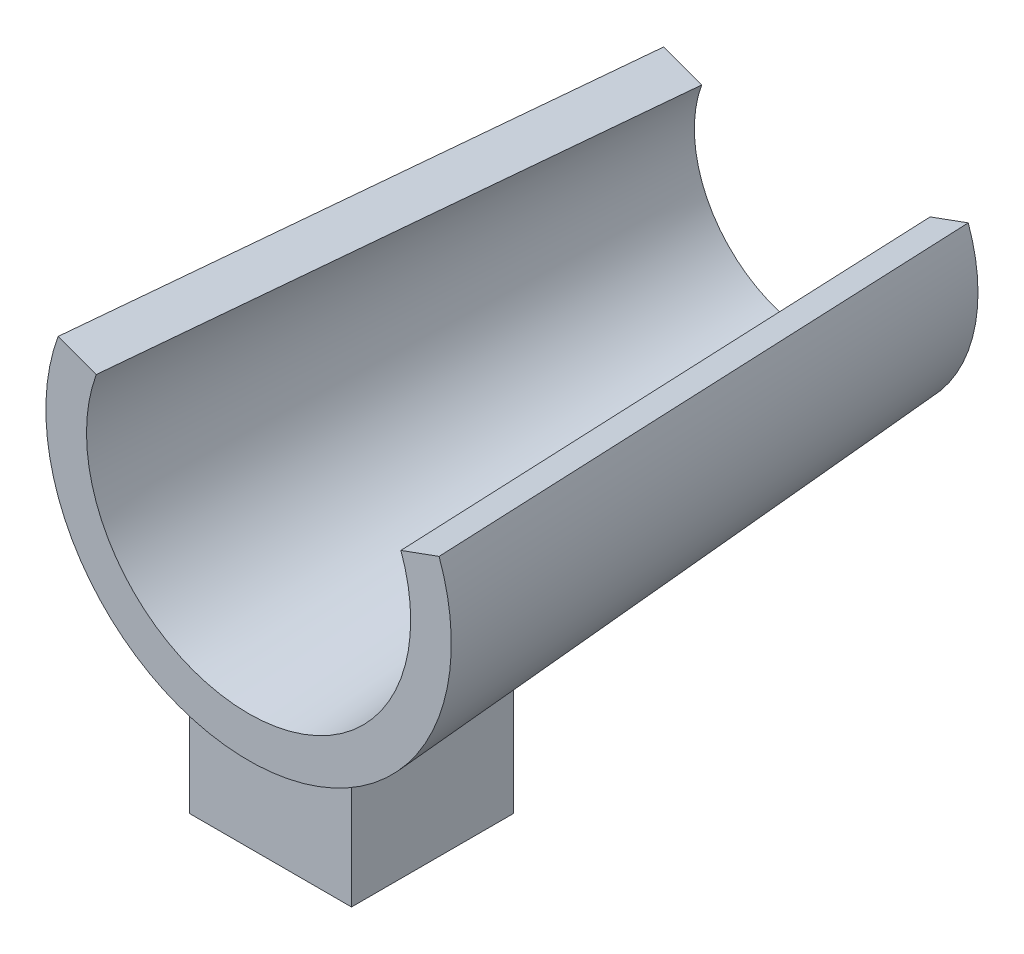
ISO-10303-21;
HEADER;
FILE_DESCRIPTION(('STEP AP214'),'2;1');
FILE_NAME('part.step','',(''),(''),'','','');
FILE_SCHEMA(('AUTOMOTIVE_DESIGN { 1 0 10303 214 1 1 1 1 }'));
ENDSEC;
DATA;
#1=APPLICATION_CONTEXT('core data for automotive mechanical design processes');
#2=APPLICATION_PROTOCOL_DEFINITION('international standard','automotive_design',2000,#1);
#3=PRODUCT_CONTEXT('',#1,'mechanical');
#4=PRODUCT('Part','Part','',(#3));
#5=PRODUCT_RELATED_PRODUCT_CATEGORY('part','',(#4));
#6=PRODUCT_DEFINITION_FORMATION('','',#4);
#7=PRODUCT_DEFINITION_CONTEXT('part definition',#1,'design');
#8=PRODUCT_DEFINITION('design','',#6,#7);
#9=PRODUCT_DEFINITION_SHAPE('','',#8);
#10=(LENGTH_UNIT() NAMED_UNIT(*) SI_UNIT(.MILLI.,.METRE.));
#11=(NAMED_UNIT(*) PLANE_ANGLE_UNIT() SI_UNIT($,.RADIAN.));
#12=(NAMED_UNIT(*) SI_UNIT($,.STERADIAN.) SOLID_ANGLE_UNIT());
#13=UNCERTAINTY_MEASURE_WITH_UNIT(LENGTH_MEASURE(1.E-05),#10,'distance_accuracy_value','');
#14=(GEOMETRIC_REPRESENTATION_CONTEXT(3) GLOBAL_UNCERTAINTY_ASSIGNED_CONTEXT((#13)) GLOBAL_UNIT_ASSIGNED_CONTEXT((#10,
#11,#12)) REPRESENTATION_CONTEXT('',''));
#15=CARTESIAN_POINT('',(0.,0.,0.));
#16=DIRECTION('',(0.,0.,1.));
#17=DIRECTION('',(1.,0.,0.));
#18=AXIS2_PLACEMENT_3D('',#15,#16,#17);
#19=CARTESIAN_POINT('',(0.,0.,-88.9));
#20=DIRECTION('',(0.,0.,1.));
#21=DIRECTION('',(1.,0.,0.));
#22=AXIS2_PLACEMENT_3D('',#19,#20,#21);
#23=CONICAL_SURFACE('',#22,50.8,0.0714885225819093);
#24=CARTESIAN_POINT('',(0.,0.,82.0460584084267));
#25=DIRECTION('',(0.,0.,-1.));
#26=DIRECTION('',(-1.,0.,0.));
#27=AXIS2_PLACEMENT_3D('',#24,#25,#26);
#28=CIRCLE('',#27,63.0415421766647);
#29=CARTESIAN_POINT('',(-25.4,-57.698145897526,82.0460584084267));
#30=VERTEX_POINT('',#29);
#31=CARTESIAN_POINT('',(25.4,-57.698145897526,82.0460584084267));
#32=VERTEX_POINT('',#31);
#33=EDGE_CURVE('E117',#30,#32,#28,.F.);
#34=ORIENTED_EDGE('',*,*,#33,.T.);
#35=CARTESIAN_POINT('',(25.4,-63.4436922858804,156.026404573247));
#36=CARTESIAN_POINT('',(25.4,-62.7222551481646,146.673726548939));
#37=CARTESIAN_POINT('',(25.4,-61.9991408923068,137.321178020465));
#38=CARTESIAN_POINT('',(25.4,-60.5491563843255,118.616371756775));
#39=CARTESIAN_POINT('',(25.4,-59.8222861320438,109.26411402157));
#40=CARTESIAN_POINT('',(25.4,-57.6354408650671,81.2078519748423));
#41=CARTESIAN_POINT('',(25.4,-56.1692293302343,62.5043327353433));
#42=CARTESIAN_POINT('',(25.4,-53.9541725633273,34.4502908301632));
#43=CARTESIAN_POINT('',(25.4,-53.2131968108505,25.0991465316928));
#44=CARTESIAN_POINT('',(25.4,-51.725279280106,6.39733284429531));
#45=CARTESIAN_POINT('',(25.4,-50.9783375021332,-2.9533365446553));
#46=CARTESIAN_POINT('',(25.4,-49.4776739620041,-21.6541441460642));
#47=CARTESIAN_POINT('',(25.4,-48.7239521907997,-31.0042823577969));
#48=CARTESIAN_POINT('',(25.4,-47.2086791920287,-49.7039258936828));
#49=CARTESIAN_POINT('',(25.4,-46.4471279630497,-59.0534312177216));
#50=CARTESIAN_POINT('',(25.4,-45.6811369130909,-68.4025737963587));
#51=B_SPLINE_CURVE_WITH_KNOTS('',3,(#35,#36,#37,#38,#39,#40,#41,#42,#43,#44,#45,#46,#47,#48,#49,
#50),.UNSPECIFIED.,.F.,.F.,(4,2,2,2,2,2,2,4),(0.,28.1413839752407,56.2827691355422,
112.56546096362,140.706825872801,168.848189391309,196.989590471789,225.130996629629),.UNSPECIFIED.);
#52=CARTESIAN_POINT('',(25.4,-53.6995592024864,31.2460584084267));
#53=VERTEX_POINT('',#52);
#54=EDGE_CURVE('E121',#32,#53,#51,.T.);
#55=ORIENTED_EDGE('',*,*,#54,.T.);
#56=CARTESIAN_POINT('',(0.,0.,31.2460584084267));
#57=DIRECTION('',(0.,0.,1.));
#58=DIRECTION('',(1.,0.,0.));
#59=AXIS2_PLACEMENT_3D('',#56,#57,#58);
#60=CIRCLE('',#59,59.4037259651391);
#61=CARTESIAN_POINT('',(-25.4,-53.6995592024864,31.2460584084267));
#62=VERTEX_POINT('',#61);
#63=EDGE_CURVE('E127',#53,#62,#60,.F.);
#64=ORIENTED_EDGE('',*,*,#63,.T.);
#65=CARTESIAN_POINT('',(-25.4,-45.6811369130909,-68.4025737963587));
#66=CARTESIAN_POINT('',(-25.4,-46.3450748098802,-60.2991549291811));
#67=CARTESIAN_POINT('',(-25.4,-47.0056639929896,-52.1954622819094));
#68=CARTESIAN_POINT('',(-25.4,-48.3208510582397,-35.987591572325));
#69=CARTESIAN_POINT('',(-25.4,-48.9754489409948,-27.8834135100622));
#70=CARTESIAN_POINT('',(-25.4,-50.2793593007695,-11.6746370162661));
#71=CARTESIAN_POINT('',(-25.4,-50.9286717807644,-3.57003858497214));
#72=CARTESIAN_POINT('',(-25.4,-52.2225805717993,12.6395347674692));
#73=CARTESIAN_POINT('',(-25.4,-52.8671768827957,20.74450968862));
#74=CARTESIAN_POINT('',(-25.4,-53.9047307358717,33.8335868702851));
#75=CARTESIAN_POINT('',(-25.4,-54.2990019447028,38.8175850645336));
#76=CARTESIAN_POINT('',(-25.4,-55.4308742098432,53.1529942717143));
#77=CARTESIAN_POINT('',(-25.4,-56.1665900572456,62.5045541883539));
#78=CARTESIAN_POINT('',(-25.4,-57.633346142092,81.2080410519595));
#79=CARTESIAN_POINT('',(-25.4,-58.3643863792773,90.5599679989457));
#80=CARTESIAN_POINT('',(-25.4,-59.8222938227081,109.264146682297));
#81=CARTESIAN_POINT('',(-25.4,-60.5491610291346,118.616398418648));
#82=CARTESIAN_POINT('',(-25.4,-61.9991394056099,137.321192098086));
#83=CARTESIAN_POINT('',(-25.4,-62.7222505760523,146.673734041144));
#84=CARTESIAN_POINT('',(-25.4,-63.4436922858804,156.026404573247));
#85=B_SPLINE_CURVE_WITH_KNOTS('',3,(#65,#66,#67,#68,#69,#70,#71,#72,#73,#74,#75,#76,#77,#78,#79,
#80,#81,#82,#83,#84),.UNSPECIFIED.,.F.,.F.,(4,2,2,2,2,2,2,2,2,4),(0.,24.3917162646954,
48.7834300281695,73.1751300597433,97.566830316207,112.565536417146,140.706902280535,
168.848269700947,196.989635900051,225.1309991505),.UNSPECIFIED.);
#86=EDGE_CURVE('E60',#62,#30,#85,.T.);
#87=ORIENTED_EDGE('',*,*,#86,.T.);
#88=EDGE_LOOP('',(#34,#55,#64,#87));
#89=FACE_BOUND('',#88,.T.);
#90=CARTESIAN_POINT('',(0.,0.,88.9));
#91=DIRECTION('',(0.,0.,1.));
#92=DIRECTION('',(1.,0.,0.));
#93=AXIS2_PLACEMENT_3D('',#90,#91,#92);
#94=CIRCLE('',#93,63.5323567403394);
#95=CARTESIAN_POINT('',(-59.7008868100346,21.7293457581488,88.9));
#96=VERTEX_POINT('',#95);
#97=CARTESIAN_POINT('',(59.7008868100347,21.7293457581484,88.9));
#98=VERTEX_POINT('',#97);
#99=EDGE_CURVE('E11',#96,#98,#94,.T.);
#100=ORIENTED_EDGE('',*,*,#99,.F.);
#101=DIRECTION('',(-0.0671200323300697,0.0244296938911311,0.997445783647611));
#102=VECTOR('',#101,1.);
#103=CARTESIAN_POINT('',(-53.4445683976374,19.4522320799446,-4.07281608737899));
#104=LINE('',#103,#102);
#105=CARTESIAN_POINT('',(-47.736385135924,17.3746232809443,-88.9));
#106=VERTEX_POINT('',#105);
#107=EDGE_CURVE('E205',#106,#96,#104,.T.);
#108=ORIENTED_EDGE('',*,*,#107,.F.);
#109=CARTESIAN_POINT('',(0.,0.,-88.9));
#110=DIRECTION('',(0.,0.,1.));
#111=DIRECTION('',(1.,0.,0.));
#112=AXIS2_PLACEMENT_3D('',#109,#110,#111);
#113=CIRCLE('',#112,50.8);
#114=CARTESIAN_POINT('',(47.7363851359241,17.374623280944,-88.9));
#115=VERTEX_POINT('',#114);
#116=EDGE_CURVE('E197',#106,#115,#113,.T.);
#117=ORIENTED_EDGE('',*,*,#116,.T.);
#118=DIRECTION('',(0.0671200323300699,0.0244296938911307,0.997445783647611));
#119=VECTOR('',#118,1.);
#120=CARTESIAN_POINT('',(53.4445683976375,19.4522320799443,-4.07281608737899));
#121=LINE('',#120,#119);
#122=EDGE_CURVE('E218',#115,#98,#121,.T.);
#123=ORIENTED_EDGE('',*,*,#122,.T.);
#124=EDGE_LOOP('',(#100,#108,#117,#123));
#125=FACE_BOUND('',#124,.T.);
#126=ADVANCED_FACE('F41',(#89,#125),#23,.T.);
#127=CARTESIAN_POINT('',(-1.75378336319789E-13,0.,88.9));
#128=DIRECTION('',(0.,0.,1.));
#129=DIRECTION('',(1.,0.,0.));
#130=AXIS2_PLACEMENT_3D('',#127,#128,#129);
#131=PLANE('',#130);
#132=CARTESIAN_POINT('',(0.,0.,88.9));
#133=DIRECTION('',(0.,0.,1.));
#134=DIRECTION('',(1.,0.,0.));
#135=AXIS2_PLACEMENT_3D('',#132,#133,#134);
#136=CIRCLE('',#135,50.8);
#137=CARTESIAN_POINT('',(-47.736385135924,17.3746232809443,88.9));
#138=VERTEX_POINT('',#137);
#139=CARTESIAN_POINT('',(47.7363851359241,17.374623280944,88.9));
#140=VERTEX_POINT('',#139);
#141=EDGE_CURVE('E49',#138,#140,#136,.T.);
#142=ORIENTED_EDGE('',*,*,#141,.F.);
#143=DIRECTION('',(-0.939692620785906,0.342020143325676,0.));
#144=VECTOR('',#143,1.);
#145=CARTESIAN_POINT('',(-1.75378336319789E-13,0.,88.9000000000001));
#146=LINE('',#145,#144);
#147=EDGE_CURVE('E204',#138,#96,#146,.T.);
#148=ORIENTED_EDGE('',*,*,#147,.T.);
#149=ORIENTED_EDGE('',*,*,#99,.T.);
#150=DIRECTION('',(0.939692620785908,0.342020143325669,0.));
#151=VECTOR('',#150,1.);
#152=CARTESIAN_POINT('',(1.82317230223697E-13,0.,88.9000000000001));
#153=LINE('',#152,#151);
#154=EDGE_CURVE('E213',#140,#98,#153,.T.);
#155=ORIENTED_EDGE('',*,*,#154,.F.);
#156=EDGE_LOOP('',(#142,#148,#149,#155));
#157=FACE_BOUND('',#156,.T.);
#158=ADVANCED_FACE('F43',(#157),#131,.T.);
#159=CARTESIAN_POINT('',(0.,0.,-88.9));
#160=DIRECTION('',(0.,0.,1.));
#161=DIRECTION('',(1.,0.,0.));
#162=AXIS2_PLACEMENT_3D('',#159,#160,#161);
#163=CONICAL_SURFACE('',#162,38.1,0.0713074647852903);
#164=CARTESIAN_POINT('',(0.,0.,-88.9));
#165=DIRECTION('',(0.,0.,1.));
#166=DIRECTION('',(1.,0.,0.));
#167=AXIS2_PLACEMENT_3D('',#164,#165,#166);
#168=CIRCLE('',#167,38.1);
#169=CARTESIAN_POINT('',(-35.802288851943,13.0309674607083,-88.9));
#170=VERTEX_POINT('',#169);
#171=CARTESIAN_POINT('',(35.8022888519431,13.030967460708,-88.9));
#172=VERTEX_POINT('',#171);
#173=EDGE_CURVE('E189',#170,#172,#168,.T.);
#174=ORIENTED_EDGE('',*,*,#173,.F.);
#175=DIRECTION('',(-0.0669503271264031,0.0243679262483964,0.997458699830735));
#176=VECTOR('',#175,1.);
#177=CARTESIAN_POINT('',(-41.5573099025938,15.1256238207206,-3.15888324873096));
#178=LINE('',#177,#176);
#179=EDGE_CURVE('E194',#170,#138,#178,.T.);
#180=ORIENTED_EDGE('',*,*,#179,.T.);
#181=ORIENTED_EDGE('',*,*,#141,.T.);
#182=DIRECTION('',(0.0669503271264034,0.024367926248396,0.997458699830735));
#183=VECTOR('',#182,1.);
#184=CARTESIAN_POINT('',(41.5573099025939,15.1256238207203,-3.15888324873096));
#185=LINE('',#184,#183);
#186=EDGE_CURVE('E193',#172,#140,#185,.T.);
#187=ORIENTED_EDGE('',*,*,#186,.F.);
#188=EDGE_LOOP('',(#174,#180,#181,#187));
#189=FACE_BOUND('',#188,.T.);
#190=ADVANCED_FACE('F180',(#189),#163,.F.);
#191=CARTESIAN_POINT('',(-1.89301627792615E-13,0.,-88.9));
#192=DIRECTION('',(0.,0.,1.));
#193=DIRECTION('',(1.,0.,0.));
#194=AXIS2_PLACEMENT_3D('',#191,#192,#193);
#195=PLANE('',#194);
#196=DIRECTION('',(-0.939692620785906,0.342020143325676,0.));
#197=VECTOR('',#196,1.);
#198=CARTESIAN_POINT('',(-1.89301627792615E-13,0.,-88.9000000000001));
#199=LINE('',#198,#197);
#200=EDGE_CURVE('E199',#170,#106,#199,.T.);
#201=ORIENTED_EDGE('',*,*,#200,.F.);
#202=ORIENTED_EDGE('',*,*,#173,.T.);
#203=DIRECTION('',(0.939692620785908,0.342020143325669,0.));
#204=VECTOR('',#203,1.);
#205=CARTESIAN_POINT('',(1.82362733888708E-13,0.,-88.9000000000001));
#206=LINE('',#205,#204);
#207=EDGE_CURVE('E212',#172,#115,#206,.T.);
#208=ORIENTED_EDGE('',*,*,#207,.T.);
#209=ORIENTED_EDGE('',*,*,#116,.F.);
#210=EDGE_LOOP('',(#201,#202,#208,#209));
#211=FACE_BOUND('',#210,.T.);
#212=ADVANCED_FACE('F174',(#211),#195,.F.);
#213=CARTESIAN_POINT('',(0.,0.,0.));
#214=DIRECTION('',(-0.342020143325676,-0.939692620785906,0.));
#215=DIRECTION('',(0.,0.,1.));
#216=AXIS2_PLACEMENT_3D('',#213,#214,#215);
#217=PLANE('',#216);
#218=ORIENTED_EDGE('',*,*,#107,.T.);
#219=ORIENTED_EDGE('',*,*,#147,.F.);
#220=ORIENTED_EDGE('',*,*,#179,.F.);
#221=ORIENTED_EDGE('',*,*,#200,.T.);
#222=EDGE_LOOP('',(#218,#219,#220,#221));
#223=FACE_BOUND('',#222,.T.);
#224=ADVANCED_FACE('F166',(#223),#217,.F.);
#225=CARTESIAN_POINT('',(0.,0.,0.));
#226=DIRECTION('',(-0.342020143325669,0.939692620785908,0.));
#227=DIRECTION('',(0.,0.,1.));
#228=AXIS2_PLACEMENT_3D('',#225,#226,#227);
#229=PLANE('',#228);
#230=ORIENTED_EDGE('',*,*,#122,.F.);
#231=ORIENTED_EDGE('',*,*,#207,.F.);
#232=ORIENTED_EDGE('',*,*,#186,.T.);
#233=ORIENTED_EDGE('',*,*,#154,.T.);
#234=EDGE_LOOP('',(#230,#231,#232,#233));
#235=FACE_BOUND('',#234,.T.);
#236=ADVANCED_FACE('F164',(#235),#229,.T.);
#237=CARTESIAN_POINT('',(25.4,-94.0123567403394,31.2460584084267));
#238=DIRECTION('',(1.,0.,0.));
#239=DIRECTION('',(0.,0.,-1.));
#240=AXIS2_PLACEMENT_3D('',#237,#238,#239);
#241=PLANE('',#240);
#242=DIRECTION('',(0.,1.,0.));
#243=VECTOR('',#242,1.);
#244=CARTESIAN_POINT('',(25.4,-94.0123567403394,31.2460584084267));
#245=LINE('',#244,#243);
#246=CARTESIAN_POINT('',(25.4,-94.0123567403394,31.2460584084267));
#247=VERTEX_POINT('',#246);
#248=EDGE_CURVE('E222',#247,#53,#245,.T.);
#249=ORIENTED_EDGE('',*,*,#248,.T.);
#250=ORIENTED_EDGE('',*,*,#54,.F.);
#251=DIRECTION('',(0.,1.,0.));
#252=VECTOR('',#251,1.);
#253=CARTESIAN_POINT('',(25.4,-94.0123567403394,82.0460584084267));
#254=LINE('',#253,#252);
#255=CARTESIAN_POINT('',(25.4,-94.0123567403394,82.0460584084267));
#256=VERTEX_POINT('',#255);
#257=EDGE_CURVE('E115',#256,#32,#254,.T.);
#258=ORIENTED_EDGE('',*,*,#257,.F.);
#259=DIRECTION('',(0.,0.,-1.));
#260=VECTOR('',#259,1.);
#261=CARTESIAN_POINT('',(25.4,-94.0123567403394,31.2460584084267));
#262=LINE('',#261,#260);
#263=EDGE_CURVE('E124',#256,#247,#262,.T.);
#264=ORIENTED_EDGE('',*,*,#263,.T.);
#265=EDGE_LOOP('',(#249,#250,#258,#264));
#266=FACE_BOUND('',#265,.T.);
#267=ADVANCED_FACE('F160',(#266),#241,.T.);
#268=CARTESIAN_POINT('',(-25.4,-94.0123567403394,82.0460584084267));
#269=DIRECTION('',(0.,0.,1.));
#270=DIRECTION('',(1.,0.,0.));
#271=AXIS2_PLACEMENT_3D('',#268,#269,#270);
#272=PLANE('',#271);
#273=ORIENTED_EDGE('',*,*,#257,.T.);
#274=ORIENTED_EDGE('',*,*,#33,.F.);
#275=DIRECTION('',(0.,1.,0.));
#276=VECTOR('',#275,1.);
#277=CARTESIAN_POINT('',(-25.4,-94.0123567403394,82.0460584084267));
#278=LINE('',#277,#276);
#279=CARTESIAN_POINT('',(-25.4,-94.0123567403394,82.0460584084267));
#280=VERTEX_POINT('',#279);
#281=EDGE_CURVE('E102',#280,#30,#278,.T.);
#282=ORIENTED_EDGE('',*,*,#281,.F.);
#283=DIRECTION('',(1.,0.,0.));
#284=VECTOR('',#283,1.);
#285=CARTESIAN_POINT('',(-25.4,-94.0123567403394,82.0460584084267));
#286=LINE('',#285,#284);
#287=EDGE_CURVE('E224',#280,#256,#286,.T.);
#288=ORIENTED_EDGE('',*,*,#287,.T.);
#289=EDGE_LOOP('',(#273,#274,#282,#288));
#290=FACE_BOUND('',#289,.T.);
#291=ADVANCED_FACE('F120',(#290),#272,.T.);
#292=CARTESIAN_POINT('',(-25.4,-94.0123567403394,31.2460584084267));
#293=DIRECTION('',(-1.,0.,0.));
#294=DIRECTION('',(0.,0.,1.));
#295=AXIS2_PLACEMENT_3D('',#292,#293,#294);
#296=PLANE('',#295);
#297=ORIENTED_EDGE('',*,*,#281,.T.);
#298=ORIENTED_EDGE('',*,*,#86,.F.);
#299=DIRECTION('',(0.,1.,0.));
#300=VECTOR('',#299,1.);
#301=CARTESIAN_POINT('',(-25.4,-94.0123567403394,31.2460584084267));
#302=LINE('',#301,#300);
#303=CARTESIAN_POINT('',(-25.4,-94.0123567403394,31.2460584084267));
#304=VERTEX_POINT('',#303);
#305=EDGE_CURVE('E114',#304,#62,#302,.T.);
#306=ORIENTED_EDGE('',*,*,#305,.F.);
#307=DIRECTION('',(0.,0.,1.));
#308=VECTOR('',#307,1.);
#309=CARTESIAN_POINT('',(-25.4,-94.0123567403394,31.2460584084267));
#310=LINE('',#309,#308);
#311=EDGE_CURVE('E107',#304,#280,#310,.T.);
#312=ORIENTED_EDGE('',*,*,#311,.T.);
#313=EDGE_LOOP('',(#297,#298,#306,#312));
#314=FACE_BOUND('',#313,.T.);
#315=ADVANCED_FACE('F106',(#314),#296,.T.);
#316=CARTESIAN_POINT('',(-25.4,-94.0123567403394,31.2460584084267));
#317=DIRECTION('',(0.,0.,-1.));
#318=DIRECTION('',(-1.,0.,0.));
#319=AXIS2_PLACEMENT_3D('',#316,#317,#318);
#320=PLANE('',#319);
#321=ORIENTED_EDGE('',*,*,#305,.T.);
#322=ORIENTED_EDGE('',*,*,#63,.F.);
#323=ORIENTED_EDGE('',*,*,#248,.F.);
#324=DIRECTION('',(-1.,0.,0.));
#325=VECTOR('',#324,1.);
#326=CARTESIAN_POINT('',(-25.4,-94.0123567403394,31.2460584084267));
#327=LINE('',#326,#325);
#328=EDGE_CURVE('E229',#247,#304,#327,.T.);
#329=ORIENTED_EDGE('',*,*,#328,.T.);
#330=EDGE_LOOP('',(#321,#322,#323,#329));
#331=FACE_BOUND('',#330,.T.);
#332=ADVANCED_FACE('F153',(#331),#320,.T.);
#333=CARTESIAN_POINT('',(0.,-94.0123567403394,0.));
#334=DIRECTION('',(0.,1.,0.));
#335=DIRECTION('',(0.,0.,1.));
#336=AXIS2_PLACEMENT_3D('',#333,#334,#335);
#337=PLANE('',#336);
#338=CARTESIAN_POINT('',(0.,-94.0123567403394,56.6460584084267));
#339=DIRECTION('',(0.,1.,0.));
#340=DIRECTION('',(0.,0.,1.));
#341=AXIS2_PLACEMENT_3D('',#338,#339,#340);
#342=CIRCLE('',#341,12.7);
#343=CARTESIAN_POINT('',(0.,-94.0123567403394,69.3460584084267));
#344=VERTEX_POINT('',#343);
#345=EDGE_CURVE('E44',#344,#344,#342,.T.);
#346=ORIENTED_EDGE('',*,*,#345,.T.);
#347=EDGE_LOOP('',(#346));
#348=FACE_BOUND('',#347,.T.);
#349=ORIENTED_EDGE('',*,*,#263,.F.);
#350=ORIENTED_EDGE('',*,*,#287,.F.);
#351=ORIENTED_EDGE('',*,*,#311,.F.);
#352=ORIENTED_EDGE('',*,*,#328,.F.);
#353=EDGE_LOOP('',(#349,#350,#351,#352));
#354=FACE_BOUND('',#353,.T.);
#355=ADVANCED_FACE('F147',(#348,#354),#337,.F.);
#356=CARTESIAN_POINT('',(0.,-78.1500618244074,56.6460584084267));
#357=DIRECTION('',(0.,1.,0.));
#358=DIRECTION('',(1.,0.,0.));
#359=AXIS2_PLACEMENT_3D('',#356,#357,#358);
#360=SPHERICAL_SURFACE('',#359,20.32);
#361=ORIENTED_EDGE('',*,*,#345,.F.);
#362=EDGE_LOOP('',(#361));
#363=FACE_BOUND('',#362,.T.);
#364=ADVANCED_FACE('F143',(#363),#360,.F.);
#365=CLOSED_SHELL('',(#126,#158,#190,#212,#224,#236,#267,#291,#315,#332,#355,#364));
#366=MANIFOLD_SOLID_BREP('B2',#365);
#367=ADVANCED_BREP_SHAPE_REPRESENTATION('',(#18,#366),#14);
#368=SHAPE_DEFINITION_REPRESENTATION(#9,#367);
ENDSEC;
END-ISO-10303-21;
